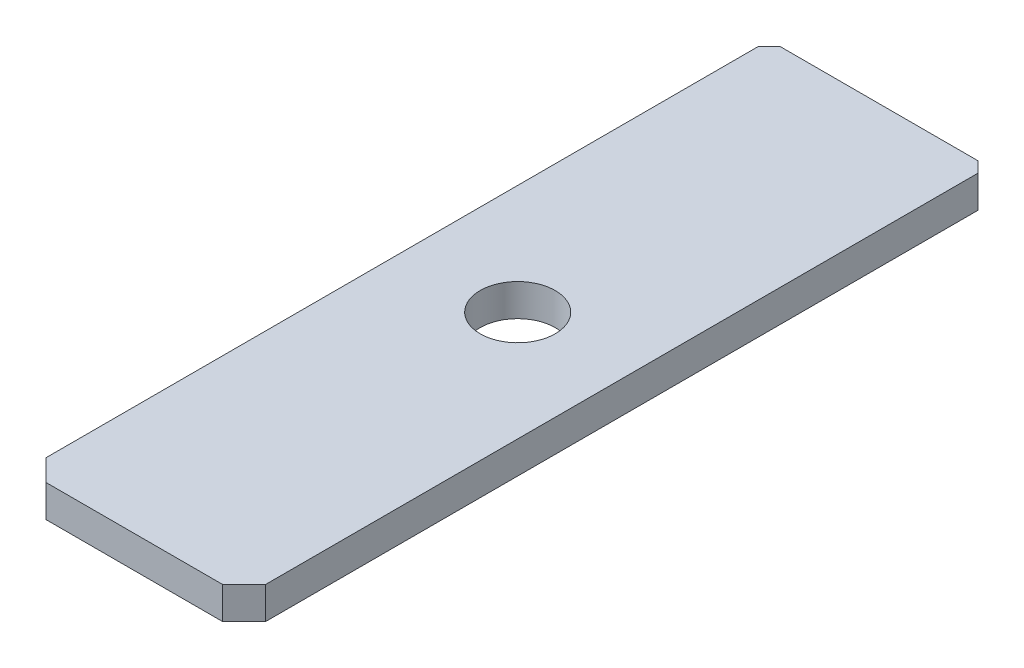
ISO-10303-21;
HEADER;
FILE_DESCRIPTION(('STEP AP214'),'2;1');
FILE_NAME('part.step','',(''),(''),'','','');
FILE_SCHEMA(('AUTOMOTIVE_DESIGN { 1 0 10303 214 1 1 1 1 }'));
ENDSEC;
DATA;
#1=APPLICATION_CONTEXT('core data for automotive mechanical design processes');
#2=APPLICATION_PROTOCOL_DEFINITION('international standard','automotive_design',2000,#1);
#3=PRODUCT_CONTEXT('',#1,'mechanical');
#4=PRODUCT('Part','Part','',(#3));
#5=PRODUCT_RELATED_PRODUCT_CATEGORY('part','',(#4));
#6=PRODUCT_DEFINITION_FORMATION('','',#4);
#7=PRODUCT_DEFINITION_CONTEXT('part definition',#1,'design');
#8=PRODUCT_DEFINITION('design','',#6,#7);
#9=PRODUCT_DEFINITION_SHAPE('','',#8);
#10=(LENGTH_UNIT() NAMED_UNIT(*) SI_UNIT(.MILLI.,.METRE.));
#11=(NAMED_UNIT(*) PLANE_ANGLE_UNIT() SI_UNIT($,.RADIAN.));
#12=(NAMED_UNIT(*) SI_UNIT($,.STERADIAN.) SOLID_ANGLE_UNIT());
#13=UNCERTAINTY_MEASURE_WITH_UNIT(LENGTH_MEASURE(1.E-05),#10,'distance_accuracy_value','');
#14=(GEOMETRIC_REPRESENTATION_CONTEXT(3) GLOBAL_UNCERTAINTY_ASSIGNED_CONTEXT((#13)) GLOBAL_UNIT_ASSIGNED_CONTEXT((#10,
#11,#12)) REPRESENTATION_CONTEXT('',''));
#15=CARTESIAN_POINT('',(0.,0.,0.));
#16=DIRECTION('',(0.,0.,1.));
#17=DIRECTION('',(1.,0.,0.));
#18=AXIS2_PLACEMENT_3D('',#15,#16,#17);
#19=CARTESIAN_POINT('',(5.12,1.5,-17.365));
#20=DIRECTION('',(-1.,0.,0.));
#21=DIRECTION('',(0.,0.,1.));
#22=AXIS2_PLACEMENT_3D('',#19,#20,#21);
#23=PLANE('',#22);
#24=DIRECTION('',(0.,0.,-1.));
#25=VECTOR('',#24,1.);
#26=CARTESIAN_POINT('',(5.12,1.5,-17.365));
#27=LINE('',#26,#25);
#28=CARTESIAN_POINT('',(5.12,1.5,16.365));
#29=VERTEX_POINT('',#28);
#30=CARTESIAN_POINT('',(5.11999999999999,1.5,-16.865));
#31=VERTEX_POINT('',#30);
#32=EDGE_CURVE('E125',#29,#31,#27,.T.);
#33=ORIENTED_EDGE('',*,*,#32,.F.);
#34=DIRECTION('',(0.,-1.,0.));
#35=VECTOR('',#34,1.);
#36=CARTESIAN_POINT('',(5.12,1.5,16.365));
#37=LINE('',#36,#35);
#38=CARTESIAN_POINT('',(5.12000000000001,0.,16.365));
#39=VERTEX_POINT('',#38);
#40=EDGE_CURVE('E11',#29,#39,#37,.T.);
#41=ORIENTED_EDGE('',*,*,#40,.T.);
#42=DIRECTION('',(0.,0.,-1.));
#43=VECTOR('',#42,1.);
#44=CARTESIAN_POINT('',(5.12,0.,-17.365));
#45=LINE('',#44,#43);
#46=CARTESIAN_POINT('',(5.12,0.,-16.865));
#47=VERTEX_POINT('',#46);
#48=EDGE_CURVE('E127',#39,#47,#45,.T.);
#49=ORIENTED_EDGE('',*,*,#48,.T.);
#50=DIRECTION('',(0.,1.,0.));
#51=VECTOR('',#50,1.);
#52=CARTESIAN_POINT('',(5.12,1.5,-16.865));
#53=LINE('',#52,#51);
#54=EDGE_CURVE('E140',#47,#31,#53,.T.);
#55=ORIENTED_EDGE('',*,*,#54,.T.);
#56=EDGE_LOOP('',(#33,#41,#49,#55));
#57=FACE_BOUND('',#56,.T.);
#58=ADVANCED_FACE('F32',(#57),#23,.F.);
#59=CARTESIAN_POINT('',(-5.12,1.5,-17.365));
#60=DIRECTION('',(0.,0.,1.));
#61=DIRECTION('',(1.,0.,0.));
#62=AXIS2_PLACEMENT_3D('',#59,#60,#61);
#63=PLANE('',#62);
#64=DIRECTION('',(-1.,0.,0.));
#65=VECTOR('',#64,1.);
#66=CARTESIAN_POINT('',(-5.12,0.,-17.365));
#67=LINE('',#66,#65);
#68=CARTESIAN_POINT('',(4.62,0.,-17.365));
#69=VERTEX_POINT('',#68);
#70=CARTESIAN_POINT('',(-4.62,0.,-17.365));
#71=VERTEX_POINT('',#70);
#72=EDGE_CURVE('E122',#69,#71,#67,.T.);
#73=ORIENTED_EDGE('',*,*,#72,.T.);
#74=DIRECTION('',(0.,1.,0.));
#75=VECTOR('',#74,1.);
#76=CARTESIAN_POINT('',(-4.62,1.5,-17.365));
#77=LINE('',#76,#75);
#78=CARTESIAN_POINT('',(-4.62,1.5,-17.365));
#79=VERTEX_POINT('',#78);
#80=EDGE_CURVE('E105',#71,#79,#77,.T.);
#81=ORIENTED_EDGE('',*,*,#80,.T.);
#82=DIRECTION('',(-1.,0.,0.));
#83=VECTOR('',#82,1.);
#84=CARTESIAN_POINT('',(-5.12,1.5,-17.365));
#85=LINE('',#84,#83);
#86=CARTESIAN_POINT('',(4.61999999999999,1.5,-17.365));
#87=VERTEX_POINT('',#86);
#88=EDGE_CURVE('E269',#87,#79,#85,.T.);
#89=ORIENTED_EDGE('',*,*,#88,.F.);
#90=DIRECTION('',(0.,-1.,0.));
#91=VECTOR('',#90,1.);
#92=CARTESIAN_POINT('',(4.62,1.5,-17.365));
#93=LINE('',#92,#91);
#94=EDGE_CURVE('E110',#87,#69,#93,.T.);
#95=ORIENTED_EDGE('',*,*,#94,.T.);
#96=EDGE_LOOP('',(#73,#81,#89,#95));
#97=FACE_BOUND('',#96,.T.);
#98=ADVANCED_FACE('F173',(#97),#63,.F.);
#99=CARTESIAN_POINT('',(-5.12,1.5,-17.365));
#100=DIRECTION('',(1.,0.,0.));
#101=DIRECTION('',(0.,0.,-1.));
#102=AXIS2_PLACEMENT_3D('',#99,#100,#101);
#103=PLANE('',#102);
#104=DIRECTION('',(0.,0.,1.));
#105=VECTOR('',#104,1.);
#106=CARTESIAN_POINT('',(-5.12,0.,-17.365));
#107=LINE('',#106,#105);
#108=CARTESIAN_POINT('',(-5.12,0.,-16.865));
#109=VERTEX_POINT('',#108);
#110=CARTESIAN_POINT('',(-5.12,0.,16.365));
#111=VERTEX_POINT('',#110);
#112=EDGE_CURVE('E114',#109,#111,#107,.T.);
#113=ORIENTED_EDGE('',*,*,#112,.T.);
#114=DIRECTION('',(0.,1.,0.));
#115=VECTOR('',#114,1.);
#116=CARTESIAN_POINT('',(-5.12,1.5,16.365));
#117=LINE('',#116,#115);
#118=CARTESIAN_POINT('',(-5.12,1.5,16.365));
#119=VERTEX_POINT('',#118);
#120=EDGE_CURVE('E55',#111,#119,#117,.T.);
#121=ORIENTED_EDGE('',*,*,#120,.T.);
#122=DIRECTION('',(0.,0.,1.));
#123=VECTOR('',#122,1.);
#124=CARTESIAN_POINT('',(-5.12,1.5,-17.365));
#125=LINE('',#124,#123);
#126=CARTESIAN_POINT('',(-5.12,1.5,-16.865));
#127=VERTEX_POINT('',#126);
#128=EDGE_CURVE('E115',#127,#119,#125,.T.);
#129=ORIENTED_EDGE('',*,*,#128,.F.);
#130=DIRECTION('',(0.,-1.,0.));
#131=VECTOR('',#130,1.);
#132=CARTESIAN_POINT('',(-5.12,1.5,-16.865));
#133=LINE('',#132,#131);
#134=EDGE_CURVE('E104',#127,#109,#133,.T.);
#135=ORIENTED_EDGE('',*,*,#134,.T.);
#136=EDGE_LOOP('',(#113,#121,#129,#135));
#137=FACE_BOUND('',#136,.T.);
#138=ADVANCED_FACE('F113',(#137),#103,.F.);
#139=CARTESIAN_POINT('',(-5.12,1.5,17.365));
#140=DIRECTION('',(0.,0.,-1.));
#141=DIRECTION('',(-1.,0.,0.));
#142=AXIS2_PLACEMENT_3D('',#139,#140,#141);
#143=PLANE('',#142);
#144=DIRECTION('',(1.,0.,0.));
#145=VECTOR('',#144,1.);
#146=CARTESIAN_POINT('',(-5.12,1.5,17.365));
#147=LINE('',#146,#145);
#148=CARTESIAN_POINT('',(-4.12,1.5,17.365));
#149=VERTEX_POINT('',#148);
#150=CARTESIAN_POINT('',(4.11999999999999,1.5,17.365));
#151=VERTEX_POINT('',#150);
#152=EDGE_CURVE('E116',#149,#151,#147,.T.);
#153=ORIENTED_EDGE('',*,*,#152,.F.);
#154=DIRECTION('',(0.,-1.,0.));
#155=VECTOR('',#154,1.);
#156=CARTESIAN_POINT('',(-4.12,1.5,17.365));
#157=LINE('',#156,#155);
#158=CARTESIAN_POINT('',(-4.12,0.,17.365));
#159=VERTEX_POINT('',#158);
#160=EDGE_CURVE('E145',#149,#159,#157,.T.);
#161=ORIENTED_EDGE('',*,*,#160,.T.);
#162=DIRECTION('',(1.,0.,0.));
#163=VECTOR('',#162,1.);
#164=CARTESIAN_POINT('',(-5.12,0.,17.365));
#165=LINE('',#164,#163);
#166=CARTESIAN_POINT('',(4.11999999999999,0.,17.365));
#167=VERTEX_POINT('',#166);
#168=EDGE_CURVE('E121',#159,#167,#165,.T.);
#169=ORIENTED_EDGE('',*,*,#168,.T.);
#170=DIRECTION('',(0.,1.,0.));
#171=VECTOR('',#170,1.);
#172=CARTESIAN_POINT('',(4.11999999999999,1.5,17.365));
#173=LINE('',#172,#171);
#174=EDGE_CURVE('E143',#167,#151,#173,.T.);
#175=ORIENTED_EDGE('',*,*,#174,.T.);
#176=EDGE_LOOP('',(#153,#161,#169,#175));
#177=FACE_BOUND('',#176,.T.);
#178=ADVANCED_FACE('F158',(#177),#143,.F.);
#179=CARTESIAN_POINT('',(5.12,1.5,17.365));
#180=DIRECTION('',(0.,1.,0.));
#181=DIRECTION('',(0.,0.,1.));
#182=AXIS2_PLACEMENT_3D('',#179,#180,#181);
#183=PLANE('',#182);
#184=CARTESIAN_POINT('',(0.,1.5,-0.515000000000002));
#185=DIRECTION('',(0.,1.,0.));
#186=DIRECTION('',(0.,0.,1.));
#187=AXIS2_PLACEMENT_3D('',#184,#185,#186);
#188=CIRCLE('',#187,1.75);
#189=CARTESIAN_POINT('',(0.,1.5,1.235));
#190=VERTEX_POINT('',#189);
#191=EDGE_CURVE('E264',#190,#190,#188,.T.);
#192=ORIENTED_EDGE('',*,*,#191,.F.);
#193=EDGE_LOOP('',(#192));
#194=FACE_BOUND('',#193,.T.);
#195=ORIENTED_EDGE('',*,*,#128,.T.);
#196=DIRECTION('',(-0.707106781186546,0.,-0.707106781186549));
#197=VECTOR('',#196,1.);
#198=CARTESIAN_POINT('',(0.499999999999984,1.5,21.985));
#199=LINE('',#198,#197);
#200=EDGE_CURVE('E40',#119,#149,#199,.F.);
#201=ORIENTED_EDGE('',*,*,#200,.T.);
#202=ORIENTED_EDGE('',*,*,#152,.T.);
#203=DIRECTION('',(-0.70710678118655,0.,0.707106781186545));
#204=VECTOR('',#203,1.);
#205=CARTESIAN_POINT('',(4.62,1.5,16.865));
#206=LINE('',#205,#204);
#207=EDGE_CURVE('E47',#151,#29,#206,.F.);
#208=ORIENTED_EDGE('',*,*,#207,.T.);
#209=ORIENTED_EDGE('',*,*,#32,.T.);
#210=DIRECTION('',(0.707106781186545,0.,0.70710678118655));
#211=VECTOR('',#210,1.);
#212=CARTESIAN_POINT('',(22.235,1.5,0.250000000000122));
#213=LINE('',#212,#211);
#214=EDGE_CURVE('E136',#31,#87,#213,.F.);
#215=ORIENTED_EDGE('',*,*,#214,.T.);
#216=ORIENTED_EDGE('',*,*,#88,.T.);
#217=DIRECTION('',(0.70710678118655,0.,-0.707106781186545));
#218=VECTOR('',#217,1.);
#219=CARTESIAN_POINT('',(-17.115,1.5,-4.87000000000012));
#220=LINE('',#219,#218);
#221=EDGE_CURVE('E138',#79,#127,#220,.F.);
#222=ORIENTED_EDGE('',*,*,#221,.T.);
#223=EDGE_LOOP('',(#195,#201,#202,#208,#209,#215,#216,#222));
#224=FACE_BOUND('',#223,.T.);
#225=ADVANCED_FACE('F154',(#194,#224),#183,.T.);
#226=CARTESIAN_POINT('',(5.12,0.,17.365));
#227=DIRECTION('',(0.,1.,0.));
#228=DIRECTION('',(0.,0.,1.));
#229=AXIS2_PLACEMENT_3D('',#226,#227,#228);
#230=PLANE('',#229);
#231=CARTESIAN_POINT('',(0.,0.,-0.515000000000002));
#232=DIRECTION('',(0.,1.,0.));
#233=DIRECTION('',(0.,0.,1.));
#234=AXIS2_PLACEMENT_3D('',#231,#232,#233);
#235=CIRCLE('',#234,1.75);
#236=CARTESIAN_POINT('',(0.,0.,1.235));
#237=VERTEX_POINT('',#236);
#238=EDGE_CURVE('E261',#237,#237,#235,.T.);
#239=ORIENTED_EDGE('',*,*,#238,.T.);
#240=EDGE_LOOP('',(#239));
#241=FACE_BOUND('',#240,.T.);
#242=ORIENTED_EDGE('',*,*,#168,.F.);
#243=DIRECTION('',(0.707106781186546,0.,0.707106781186549));
#244=VECTOR('',#243,1.);
#245=CARTESIAN_POINT('',(-4.12,0.,17.365));
#246=LINE('',#245,#244);
#247=EDGE_CURVE('E120',#159,#111,#246,.F.);
#248=ORIENTED_EDGE('',*,*,#247,.T.);
#249=ORIENTED_EDGE('',*,*,#112,.F.);
#250=DIRECTION('',(-0.70710678118655,0.,0.707106781186545));
#251=VECTOR('',#250,1.);
#252=CARTESIAN_POINT('',(-5.12,0.,-16.865));
#253=LINE('',#252,#251);
#254=EDGE_CURVE('E100',#109,#71,#253,.F.);
#255=ORIENTED_EDGE('',*,*,#254,.T.);
#256=ORIENTED_EDGE('',*,*,#72,.F.);
#257=DIRECTION('',(-0.707106781186545,0.,-0.70710678118655));
#258=VECTOR('',#257,1.);
#259=CARTESIAN_POINT('',(4.62,0.,-17.365));
#260=LINE('',#259,#258);
#261=EDGE_CURVE('E111',#69,#47,#260,.F.);
#262=ORIENTED_EDGE('',*,*,#261,.T.);
#263=ORIENTED_EDGE('',*,*,#48,.F.);
#264=DIRECTION('',(0.70710678118655,0.,-0.707106781186545));
#265=VECTOR('',#264,1.);
#266=CARTESIAN_POINT('',(5.12,0.,16.365));
#267=LINE('',#266,#265);
#268=EDGE_CURVE('E148',#39,#167,#267,.F.);
#269=ORIENTED_EDGE('',*,*,#268,.T.);
#270=EDGE_LOOP('',(#242,#248,#249,#255,#256,#262,#263,#269));
#271=FACE_BOUND('',#270,.T.);
#272=ADVANCED_FACE('F119',(#241,#271),#230,.F.);
#273=CARTESIAN_POINT('',(-5.12,1.5,-16.865));
#274=DIRECTION('',(0.707106781186545,0.,0.70710678118655));
#275=DIRECTION('',(0.70710678118655,0.,-0.707106781186545));
#276=AXIS2_PLACEMENT_3D('',#273,#274,#275);
#277=PLANE('',#276);
#278=ORIENTED_EDGE('',*,*,#221,.F.);
#279=ORIENTED_EDGE('',*,*,#80,.F.);
#280=ORIENTED_EDGE('',*,*,#254,.F.);
#281=ORIENTED_EDGE('',*,*,#134,.F.);
#282=EDGE_LOOP('',(#278,#279,#280,#281));
#283=FACE_BOUND('',#282,.T.);
#284=ADVANCED_FACE('F103',(#283),#277,.F.);
#285=CARTESIAN_POINT('',(4.62,1.5,-17.365));
#286=DIRECTION('',(-0.70710678118655,0.,0.707106781186545));
#287=DIRECTION('',(0.707106781186545,0.,0.70710678118655));
#288=AXIS2_PLACEMENT_3D('',#285,#286,#287);
#289=PLANE('',#288);
#290=ORIENTED_EDGE('',*,*,#214,.F.);
#291=ORIENTED_EDGE('',*,*,#54,.F.);
#292=ORIENTED_EDGE('',*,*,#261,.F.);
#293=ORIENTED_EDGE('',*,*,#94,.F.);
#294=EDGE_LOOP('',(#290,#291,#292,#293));
#295=FACE_BOUND('',#294,.T.);
#296=ADVANCED_FACE('F163',(#295),#289,.F.);
#297=CARTESIAN_POINT('',(-4.12,1.5,17.365));
#298=DIRECTION('',(0.707106781186549,0.,-0.707106781186546));
#299=DIRECTION('',(-0.707106781186546,0.,-0.707106781186549));
#300=AXIS2_PLACEMENT_3D('',#297,#298,#299);
#301=PLANE('',#300);
#302=ORIENTED_EDGE('',*,*,#200,.F.);
#303=ORIENTED_EDGE('',*,*,#120,.F.);
#304=ORIENTED_EDGE('',*,*,#247,.F.);
#305=ORIENTED_EDGE('',*,*,#160,.F.);
#306=EDGE_LOOP('',(#302,#303,#304,#305));
#307=FACE_BOUND('',#306,.T.);
#308=ADVANCED_FACE('F161',(#307),#301,.F.);
#309=CARTESIAN_POINT('',(5.12,1.5,16.365));
#310=DIRECTION('',(-0.707106781186545,0.,-0.70710678118655));
#311=DIRECTION('',(-0.70710678118655,0.,0.707106781186545));
#312=AXIS2_PLACEMENT_3D('',#309,#310,#311);
#313=PLANE('',#312);
#314=ORIENTED_EDGE('',*,*,#207,.F.);
#315=ORIENTED_EDGE('',*,*,#174,.F.);
#316=ORIENTED_EDGE('',*,*,#268,.F.);
#317=ORIENTED_EDGE('',*,*,#40,.F.);
#318=EDGE_LOOP('',(#314,#315,#316,#317));
#319=FACE_BOUND('',#318,.T.);
#320=ADVANCED_FACE('F34',(#319),#313,.F.);
#321=CARTESIAN_POINT('',(0.,0.,-0.515000000000002));
#322=DIRECTION('',(0.,1.,0.));
#323=DIRECTION('',(0.,0.,1.));
#324=AXIS2_PLACEMENT_3D('',#321,#322,#323);
#325=CYLINDRICAL_SURFACE('',#324,1.75);
#326=ORIENTED_EDGE('',*,*,#238,.F.);
#327=EDGE_LOOP('',(#326));
#328=FACE_BOUND('',#327,.T.);
#329=ORIENTED_EDGE('',*,*,#191,.T.);
#330=EDGE_LOOP('',(#329));
#331=FACE_BOUND('',#330,.T.);
#332=ADVANCED_FACE('F168',(#328,#331),#325,.F.);
#333=CLOSED_SHELL('',(#58,#98,#138,#178,#225,#272,#284,#296,#308,#320,#332));
#334=MANIFOLD_SOLID_BREP('B2',#333);
#335=ADVANCED_BREP_SHAPE_REPRESENTATION('',(#18,#334),#14);
#336=SHAPE_DEFINITION_REPRESENTATION(#9,#335);
ENDSEC;
END-ISO-10303-21;
